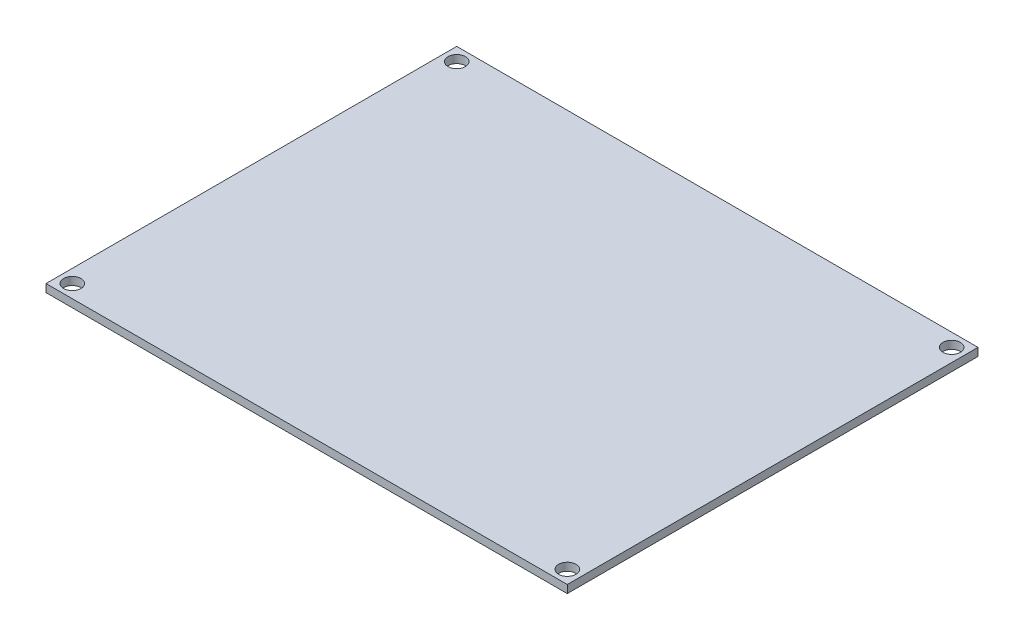
ISO-10303-21;
HEADER;
FILE_DESCRIPTION(('STEP AP214'),'2;1');
FILE_NAME('part.step','',(''),(''),'','','');
FILE_SCHEMA(('AUTOMOTIVE_DESIGN { 1 0 10303 214 1 1 1 1 }'));
ENDSEC;
DATA;
#1=APPLICATION_CONTEXT('core data for automotive mechanical design processes');
#2=APPLICATION_PROTOCOL_DEFINITION('international standard','automotive_design',2000,#1);
#3=PRODUCT_CONTEXT('',#1,'mechanical');
#4=PRODUCT('Part','Part','',(#3));
#5=PRODUCT_RELATED_PRODUCT_CATEGORY('part','',(#4));
#6=PRODUCT_DEFINITION_FORMATION('','',#4);
#7=PRODUCT_DEFINITION_CONTEXT('part definition',#1,'design');
#8=PRODUCT_DEFINITION('design','',#6,#7);
#9=PRODUCT_DEFINITION_SHAPE('','',#8);
#10=(LENGTH_UNIT() NAMED_UNIT(*) SI_UNIT(.MILLI.,.METRE.));
#11=(NAMED_UNIT(*) PLANE_ANGLE_UNIT() SI_UNIT($,.RADIAN.));
#12=(NAMED_UNIT(*) SI_UNIT($,.STERADIAN.) SOLID_ANGLE_UNIT());
#13=UNCERTAINTY_MEASURE_WITH_UNIT(LENGTH_MEASURE(1.E-05),#10,'distance_accuracy_value','');
#14=(GEOMETRIC_REPRESENTATION_CONTEXT(3) GLOBAL_UNCERTAINTY_ASSIGNED_CONTEXT((#13)) GLOBAL_UNIT_ASSIGNED_CONTEXT((#10,
#11,#12)) REPRESENTATION_CONTEXT('',''));
#15=CARTESIAN_POINT('',(0.,0.,0.));
#16=DIRECTION('',(0.,0.,1.));
#17=DIRECTION('',(1.,0.,0.));
#18=AXIS2_PLACEMENT_3D('',#15,#16,#17);
#19=CARTESIAN_POINT('',(49.5,1.5,39.));
#20=DIRECTION('',(-1.,0.,0.));
#21=DIRECTION('',(0.,0.,1.));
#22=AXIS2_PLACEMENT_3D('',#19,#20,#21);
#23=PLANE('',#22);
#24=DIRECTION('',(0.,0.,-1.));
#25=VECTOR('',#24,1.);
#26=CARTESIAN_POINT('',(49.5,0.,39.));
#27=LINE('',#26,#25);
#28=CARTESIAN_POINT('',(49.5,0.,39.));
#29=VERTEX_POINT('',#28);
#30=CARTESIAN_POINT('',(49.5,0.,-38.9999999999998));
#31=VERTEX_POINT('',#30);
#32=EDGE_CURVE('E95',#29,#31,#27,.T.);
#33=ORIENTED_EDGE('',*,*,#32,.T.);
#34=DIRECTION('',(0.,-1.,0.));
#35=VECTOR('',#34,1.);
#36=CARTESIAN_POINT('',(49.5,1.5,-38.9999999999998));
#37=LINE('',#36,#35);
#38=CARTESIAN_POINT('',(49.5,1.5,-38.9999999999998));
#39=VERTEX_POINT('',#38);
#40=EDGE_CURVE('E11',#39,#31,#37,.T.);
#41=ORIENTED_EDGE('',*,*,#40,.F.);
#42=DIRECTION('',(0.,0.,-1.));
#43=VECTOR('',#42,1.);
#44=CARTESIAN_POINT('',(49.5,1.5,39.));
#45=LINE('',#44,#43);
#46=CARTESIAN_POINT('',(49.5,1.5,39.));
#47=VERTEX_POINT('',#46);
#48=EDGE_CURVE('E83',#47,#39,#45,.T.);
#49=ORIENTED_EDGE('',*,*,#48,.F.);
#50=DIRECTION('',(0.,-1.,0.));
#51=VECTOR('',#50,1.);
#52=CARTESIAN_POINT('',(49.5,1.5,39.));
#53=LINE('',#52,#51);
#54=EDGE_CURVE('E91',#47,#29,#53,.T.);
#55=ORIENTED_EDGE('',*,*,#54,.T.);
#56=EDGE_LOOP('',(#33,#41,#49,#55));
#57=FACE_BOUND('',#56,.T.);
#58=ADVANCED_FACE('F32',(#57),#23,.F.);
#59=CARTESIAN_POINT('',(-49.5,1.5,-38.9999999999998));
#60=DIRECTION('',(0.,0.,1.));
#61=DIRECTION('',(1.,0.,0.));
#62=AXIS2_PLACEMENT_3D('',#59,#60,#61);
#63=PLANE('',#62);
#64=DIRECTION('',(-1.,0.,0.));
#65=VECTOR('',#64,1.);
#66=CARTESIAN_POINT('',(-49.5,0.,-38.9999999999998));
#67=LINE('',#66,#65);
#68=CARTESIAN_POINT('',(-49.5,0.,-38.9999999999998));
#69=VERTEX_POINT('',#68);
#70=EDGE_CURVE('E87',#31,#69,#67,.T.);
#71=ORIENTED_EDGE('',*,*,#70,.T.);
#72=DIRECTION('',(0.,-1.,0.));
#73=VECTOR('',#72,1.);
#74=CARTESIAN_POINT('',(-49.5,1.5,-38.9999999999998));
#75=LINE('',#74,#73);
#76=CARTESIAN_POINT('',(-49.5,1.5,-38.9999999999998));
#77=VERTEX_POINT('',#76);
#78=EDGE_CURVE('E40',#77,#69,#75,.T.);
#79=ORIENTED_EDGE('',*,*,#78,.F.);
#80=DIRECTION('',(-1.,0.,0.));
#81=VECTOR('',#80,1.);
#82=CARTESIAN_POINT('',(-49.5,1.5,-38.9999999999998));
#83=LINE('',#82,#81);
#84=EDGE_CURVE('E78',#39,#77,#83,.T.);
#85=ORIENTED_EDGE('',*,*,#84,.F.);
#86=ORIENTED_EDGE('',*,*,#40,.T.);
#87=EDGE_LOOP('',(#71,#79,#85,#86));
#88=FACE_BOUND('',#87,.T.);
#89=ADVANCED_FACE('F86',(#88),#63,.F.);
#90=CARTESIAN_POINT('',(-49.5,1.5,39.));
#91=DIRECTION('',(1.,0.,0.));
#92=DIRECTION('',(0.,0.,-1.));
#93=AXIS2_PLACEMENT_3D('',#90,#91,#92);
#94=PLANE('',#93);
#95=DIRECTION('',(0.,0.,1.));
#96=VECTOR('',#95,1.);
#97=CARTESIAN_POINT('',(-49.5,0.,39.));
#98=LINE('',#97,#96);
#99=CARTESIAN_POINT('',(-49.5,0.,39.));
#100=VERTEX_POINT('',#99);
#101=EDGE_CURVE('E65',#69,#100,#98,.T.);
#102=ORIENTED_EDGE('',*,*,#101,.T.);
#103=DIRECTION('',(0.,-1.,0.));
#104=VECTOR('',#103,1.);
#105=CARTESIAN_POINT('',(-49.5,1.5,39.));
#106=LINE('',#105,#104);
#107=CARTESIAN_POINT('',(-49.5,1.5,39.));
#108=VERTEX_POINT('',#107);
#109=EDGE_CURVE('E88',#108,#100,#106,.T.);
#110=ORIENTED_EDGE('',*,*,#109,.F.);
#111=DIRECTION('',(0.,0.,1.));
#112=VECTOR('',#111,1.);
#113=CARTESIAN_POINT('',(-49.5,1.5,39.));
#114=LINE('',#113,#112);
#115=EDGE_CURVE('E81',#77,#108,#114,.T.);
#116=ORIENTED_EDGE('',*,*,#115,.F.);
#117=ORIENTED_EDGE('',*,*,#78,.T.);
#118=EDGE_LOOP('',(#102,#110,#116,#117));
#119=FACE_BOUND('',#118,.T.);
#120=ADVANCED_FACE('F89',(#119),#94,.F.);
#121=CARTESIAN_POINT('',(-49.5,1.5,39.));
#122=DIRECTION('',(0.,0.,-1.));
#123=DIRECTION('',(-1.,0.,0.));
#124=AXIS2_PLACEMENT_3D('',#121,#122,#123);
#125=PLANE('',#124);
#126=DIRECTION('',(1.,0.,0.));
#127=VECTOR('',#126,1.);
#128=CARTESIAN_POINT('',(-49.5,0.,39.));
#129=LINE('',#128,#127);
#130=EDGE_CURVE('E71',#100,#29,#129,.T.);
#131=ORIENTED_EDGE('',*,*,#130,.T.);
#132=ORIENTED_EDGE('',*,*,#54,.F.);
#133=DIRECTION('',(1.,0.,0.));
#134=VECTOR('',#133,1.);
#135=CARTESIAN_POINT('',(-49.5,1.5,39.));
#136=LINE('',#135,#134);
#137=EDGE_CURVE('E48',#108,#47,#136,.T.);
#138=ORIENTED_EDGE('',*,*,#137,.F.);
#139=ORIENTED_EDGE('',*,*,#109,.T.);
#140=EDGE_LOOP('',(#131,#132,#138,#139));
#141=FACE_BOUND('',#140,.T.);
#142=ADVANCED_FACE('F103',(#141),#125,.F.);
#143=CARTESIAN_POINT('',(0.,1.5,0.));
#144=DIRECTION('',(0.,-1.,0.));
#145=DIRECTION('',(0.,0.,-1.));
#146=AXIS2_PLACEMENT_3D('',#143,#144,#145);
#147=PLANE('',#146);
#148=CARTESIAN_POINT('',(-47.,1.5,-36.5));
#149=DIRECTION('',(0.,1.,0.));
#150=DIRECTION('',(0.,0.,1.));
#151=AXIS2_PLACEMENT_3D('',#148,#149,#150);
#152=CIRCLE('',#151,1.65);
#153=CARTESIAN_POINT('',(-47.,1.5,-34.85));
#154=VERTEX_POINT('',#153);
#155=EDGE_CURVE('E115',#154,#154,#152,.T.);
#156=ORIENTED_EDGE('',*,*,#155,.F.);
#157=EDGE_LOOP('',(#156));
#158=FACE_BOUND('',#157,.T.);
#159=CARTESIAN_POINT('',(-47.,1.5,36.5));
#160=DIRECTION('',(0.,1.,0.));
#161=DIRECTION('',(0.,0.,1.));
#162=AXIS2_PLACEMENT_3D('',#159,#160,#161);
#163=CIRCLE('',#162,1.65);
#164=CARTESIAN_POINT('',(-47.,1.5,38.15));
#165=VERTEX_POINT('',#164);
#166=EDGE_CURVE('E121',#165,#165,#163,.T.);
#167=ORIENTED_EDGE('',*,*,#166,.F.);
#168=EDGE_LOOP('',(#167));
#169=FACE_BOUND('',#168,.T.);
#170=CARTESIAN_POINT('',(47.,1.5,36.5));
#171=DIRECTION('',(0.,1.,0.));
#172=DIRECTION('',(0.,0.,1.));
#173=AXIS2_PLACEMENT_3D('',#170,#171,#172);
#174=CIRCLE('',#173,1.65);
#175=CARTESIAN_POINT('',(47.,1.5,38.15));
#176=VERTEX_POINT('',#175);
#177=EDGE_CURVE('E127',#176,#176,#174,.T.);
#178=ORIENTED_EDGE('',*,*,#177,.F.);
#179=EDGE_LOOP('',(#178));
#180=FACE_BOUND('',#179,.T.);
#181=CARTESIAN_POINT('',(47.,1.5,-36.5));
#182=DIRECTION('',(0.,1.,0.));
#183=DIRECTION('',(0.,0.,1.));
#184=AXIS2_PLACEMENT_3D('',#181,#182,#183);
#185=CIRCLE('',#184,1.65);
#186=CARTESIAN_POINT('',(47.,1.5,-34.85));
#187=VERTEX_POINT('',#186);
#188=EDGE_CURVE('E109',#187,#187,#185,.T.);
#189=ORIENTED_EDGE('',*,*,#188,.F.);
#190=EDGE_LOOP('',(#189));
#191=FACE_BOUND('',#190,.T.);
#192=ORIENTED_EDGE('',*,*,#48,.T.);
#193=ORIENTED_EDGE('',*,*,#84,.T.);
#194=ORIENTED_EDGE('',*,*,#115,.T.);
#195=ORIENTED_EDGE('',*,*,#137,.T.);
#196=EDGE_LOOP('',(#192,#193,#194,#195));
#197=FACE_BOUND('',#196,.T.);
#198=ADVANCED_FACE('F79',(#158,#169,#180,#191,#197),#147,.F.);
#199=CARTESIAN_POINT('',(0.,0.,0.));
#200=DIRECTION('',(0.,-1.,0.));
#201=DIRECTION('',(0.,0.,-1.));
#202=AXIS2_PLACEMENT_3D('',#199,#200,#201);
#203=PLANE('',#202);
#204=CARTESIAN_POINT('',(-47.,0.,-36.5));
#205=DIRECTION('',(0.,1.,0.));
#206=DIRECTION('',(0.,0.,1.));
#207=AXIS2_PLACEMENT_3D('',#204,#205,#206);
#208=CIRCLE('',#207,1.65);
#209=CARTESIAN_POINT('',(-47.,0.,-34.85));
#210=VERTEX_POINT('',#209);
#211=EDGE_CURVE('E118',#210,#210,#208,.T.);
#212=ORIENTED_EDGE('',*,*,#211,.T.);
#213=EDGE_LOOP('',(#212));
#214=FACE_BOUND('',#213,.T.);
#215=CARTESIAN_POINT('',(-47.,0.,36.5));
#216=DIRECTION('',(0.,1.,0.));
#217=DIRECTION('',(0.,0.,1.));
#218=AXIS2_PLACEMENT_3D('',#215,#216,#217);
#219=CIRCLE('',#218,1.65);
#220=CARTESIAN_POINT('',(-47.,0.,38.15));
#221=VERTEX_POINT('',#220);
#222=EDGE_CURVE('E124',#221,#221,#219,.T.);
#223=ORIENTED_EDGE('',*,*,#222,.T.);
#224=EDGE_LOOP('',(#223));
#225=FACE_BOUND('',#224,.T.);
#226=CARTESIAN_POINT('',(47.,0.,36.5));
#227=DIRECTION('',(0.,1.,0.));
#228=DIRECTION('',(0.,0.,1.));
#229=AXIS2_PLACEMENT_3D('',#226,#227,#228);
#230=CIRCLE('',#229,1.65);
#231=CARTESIAN_POINT('',(47.,0.,38.15));
#232=VERTEX_POINT('',#231);
#233=EDGE_CURVE('E112',#232,#232,#230,.T.);
#234=ORIENTED_EDGE('',*,*,#233,.T.);
#235=EDGE_LOOP('',(#234));
#236=FACE_BOUND('',#235,.T.);
#237=CARTESIAN_POINT('',(47.,0.,-36.5));
#238=DIRECTION('',(0.,1.,0.));
#239=DIRECTION('',(0.,0.,1.));
#240=AXIS2_PLACEMENT_3D('',#237,#238,#239);
#241=CIRCLE('',#240,1.65);
#242=CARTESIAN_POINT('',(47.,0.,-34.85));
#243=VERTEX_POINT('',#242);
#244=EDGE_CURVE('E98',#243,#243,#241,.T.);
#245=ORIENTED_EDGE('',*,*,#244,.T.);
#246=EDGE_LOOP('',(#245));
#247=FACE_BOUND('',#246,.T.);
#248=ORIENTED_EDGE('',*,*,#32,.F.);
#249=ORIENTED_EDGE('',*,*,#130,.F.);
#250=ORIENTED_EDGE('',*,*,#101,.F.);
#251=ORIENTED_EDGE('',*,*,#70,.F.);
#252=EDGE_LOOP('',(#248,#249,#250,#251));
#253=FACE_BOUND('',#252,.T.);
#254=ADVANCED_FACE('F106',(#214,#225,#236,#247,#253),#203,.T.);
#255=CARTESIAN_POINT('',(47.,0.,-36.5));
#256=DIRECTION('',(0.,1.,0.));
#257=DIRECTION('',(0.,0.,1.));
#258=AXIS2_PLACEMENT_3D('',#255,#256,#257);
#259=CYLINDRICAL_SURFACE('',#258,1.65);
#260=ORIENTED_EDGE('',*,*,#244,.F.);
#261=EDGE_LOOP('',(#260));
#262=FACE_BOUND('',#261,.T.);
#263=ORIENTED_EDGE('',*,*,#188,.T.);
#264=EDGE_LOOP('',(#263));
#265=FACE_BOUND('',#264,.T.);
#266=ADVANCED_FACE('F139',(#262,#265),#259,.F.);
#267=CARTESIAN_POINT('',(47.,0.,36.5));
#268=DIRECTION('',(0.,1.,0.));
#269=DIRECTION('',(0.,0.,1.));
#270=AXIS2_PLACEMENT_3D('',#267,#268,#269);
#271=CYLINDRICAL_SURFACE('',#270,1.65);
#272=ORIENTED_EDGE('',*,*,#233,.F.);
#273=EDGE_LOOP('',(#272));
#274=FACE_BOUND('',#273,.T.);
#275=ORIENTED_EDGE('',*,*,#177,.T.);
#276=EDGE_LOOP('',(#275));
#277=FACE_BOUND('',#276,.T.);
#278=ADVANCED_FACE('F135',(#274,#277),#271,.F.);
#279=CARTESIAN_POINT('',(-47.,0.,36.5));
#280=DIRECTION('',(0.,1.,0.));
#281=DIRECTION('',(0.,0.,1.));
#282=AXIS2_PLACEMENT_3D('',#279,#280,#281);
#283=CYLINDRICAL_SURFACE('',#282,1.65);
#284=ORIENTED_EDGE('',*,*,#222,.F.);
#285=EDGE_LOOP('',(#284));
#286=FACE_BOUND('',#285,.T.);
#287=ORIENTED_EDGE('',*,*,#166,.T.);
#288=EDGE_LOOP('',(#287));
#289=FACE_BOUND('',#288,.T.);
#290=ADVANCED_FACE('F138',(#286,#289),#283,.F.);
#291=CARTESIAN_POINT('',(-47.,0.,-36.5));
#292=DIRECTION('',(0.,1.,0.));
#293=DIRECTION('',(0.,0.,1.));
#294=AXIS2_PLACEMENT_3D('',#291,#292,#293);
#295=CYLINDRICAL_SURFACE('',#294,1.65);
#296=ORIENTED_EDGE('',*,*,#211,.F.);
#297=EDGE_LOOP('',(#296));
#298=FACE_BOUND('',#297,.T.);
#299=ORIENTED_EDGE('',*,*,#155,.T.);
#300=EDGE_LOOP('',(#299));
#301=FACE_BOUND('',#300,.T.);
#302=ADVANCED_FACE('F202',(#298,#301),#295,.F.);
#303=CLOSED_SHELL('',(#58,#89,#120,#142,#198,#254,#266,#278,#290,#302));
#304=MANIFOLD_SOLID_BREP('B2',#303);
#305=ADVANCED_BREP_SHAPE_REPRESENTATION('',(#18,#304),#14);
#306=SHAPE_DEFINITION_REPRESENTATION(#9,#305);
ENDSEC;
END-ISO-10303-21;
